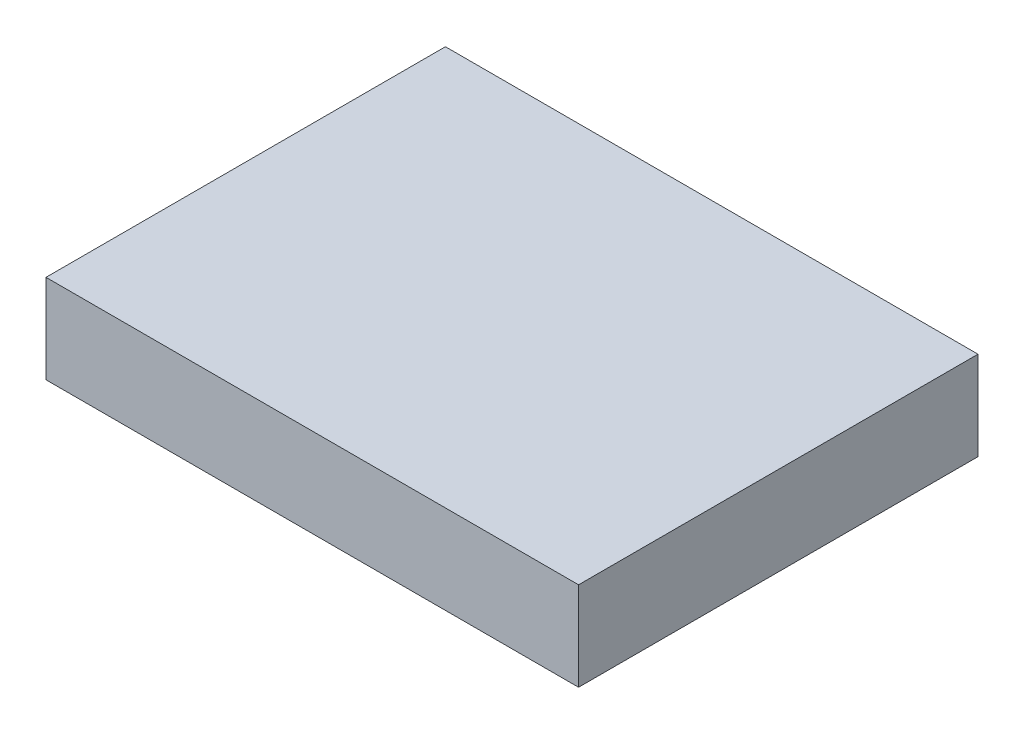
ISO-10303-21;
HEADER;
FILE_DESCRIPTION(('STEP AP214'),'2;1');
FILE_NAME('part.step','',(''),(''),'','','');
FILE_SCHEMA(('AUTOMOTIVE_DESIGN { 1 0 10303 214 1 1 1 1 }'));
ENDSEC;
DATA;
#1=APPLICATION_CONTEXT('core data for automotive mechanical design processes');
#2=APPLICATION_PROTOCOL_DEFINITION('international standard','automotive_design',2000,#1);
#3=PRODUCT_CONTEXT('',#1,'mechanical');
#4=PRODUCT('Part','Part','',(#3));
#5=PRODUCT_RELATED_PRODUCT_CATEGORY('part','',(#4));
#6=PRODUCT_DEFINITION_FORMATION('','',#4);
#7=PRODUCT_DEFINITION_CONTEXT('part definition',#1,'design');
#8=PRODUCT_DEFINITION('design','',#6,#7);
#9=PRODUCT_DEFINITION_SHAPE('','',#8);
#10=(LENGTH_UNIT() NAMED_UNIT(*) SI_UNIT(.MILLI.,.METRE.));
#11=(NAMED_UNIT(*) PLANE_ANGLE_UNIT() SI_UNIT($,.RADIAN.));
#12=(NAMED_UNIT(*) SI_UNIT($,.STERADIAN.) SOLID_ANGLE_UNIT());
#13=UNCERTAINTY_MEASURE_WITH_UNIT(LENGTH_MEASURE(1.E-05),#10,'distance_accuracy_value','');
#14=(GEOMETRIC_REPRESENTATION_CONTEXT(3) GLOBAL_UNCERTAINTY_ASSIGNED_CONTEXT((#13)) GLOBAL_UNIT_ASSIGNED_CONTEXT((#10,
#11,#12)) REPRESENTATION_CONTEXT('',''));
#15=CARTESIAN_POINT('',(0.,0.,0.));
#16=DIRECTION('',(0.,0.,1.));
#17=DIRECTION('',(1.,0.,0.));
#18=AXIS2_PLACEMENT_3D('',#15,#16,#17);
#19=CARTESIAN_POINT('',(-30.,10.,-22.5));
#20=DIRECTION('',(1.,0.,0.));
#21=DIRECTION('',(0.,0.,-1.));
#22=AXIS2_PLACEMENT_3D('',#19,#20,#21);
#23=PLANE('',#22);
#24=DIRECTION('',(0.,0.,1.));
#25=VECTOR('',#24,1.);
#26=CARTESIAN_POINT('',(-30.,0.,-22.5));
#27=LINE('',#26,#25);
#28=CARTESIAN_POINT('',(-30.,0.,-22.5));
#29=VERTEX_POINT('',#28);
#30=CARTESIAN_POINT('',(-30.,0.,22.5));
#31=VERTEX_POINT('',#30);
#32=EDGE_CURVE('E97',#29,#31,#27,.T.);
#33=ORIENTED_EDGE('',*,*,#32,.T.);
#34=DIRECTION('',(0.,-1.,0.));
#35=VECTOR('',#34,1.);
#36=CARTESIAN_POINT('',(-30.,10.,22.5));
#37=LINE('',#36,#35);
#38=CARTESIAN_POINT('',(-30.,10.,22.5));
#39=VERTEX_POINT('',#38);
#40=EDGE_CURVE('E11',#39,#31,#37,.T.);
#41=ORIENTED_EDGE('',*,*,#40,.F.);
#42=DIRECTION('',(0.,0.,1.));
#43=VECTOR('',#42,1.);
#44=CARTESIAN_POINT('',(-30.,10.,-22.5));
#45=LINE('',#44,#43);
#46=CARTESIAN_POINT('',(-30.,10.,-22.5));
#47=VERTEX_POINT('',#46);
#48=EDGE_CURVE('E85',#47,#39,#45,.T.);
#49=ORIENTED_EDGE('',*,*,#48,.F.);
#50=DIRECTION('',(0.,-1.,0.));
#51=VECTOR('',#50,1.);
#52=CARTESIAN_POINT('',(-30.,10.,-22.5));
#53=LINE('',#52,#51);
#54=EDGE_CURVE('E93',#47,#29,#53,.T.);
#55=ORIENTED_EDGE('',*,*,#54,.T.);
#56=EDGE_LOOP('',(#33,#41,#49,#55));
#57=FACE_BOUND('',#56,.T.);
#58=ADVANCED_FACE('F34',(#57),#23,.F.);
#59=CARTESIAN_POINT('',(30.,10.,22.5));
#60=DIRECTION('',(0.,0.,-1.));
#61=DIRECTION('',(-1.,0.,0.));
#62=AXIS2_PLACEMENT_3D('',#59,#60,#61);
#63=PLANE('',#62);
#64=DIRECTION('',(1.,0.,0.));
#65=VECTOR('',#64,1.);
#66=CARTESIAN_POINT('',(30.,0.,22.5));
#67=LINE('',#66,#65);
#68=CARTESIAN_POINT('',(30.,0.,22.5));
#69=VERTEX_POINT('',#68);
#70=EDGE_CURVE('E89',#31,#69,#67,.T.);
#71=ORIENTED_EDGE('',*,*,#70,.T.);
#72=DIRECTION('',(0.,-1.,0.));
#73=VECTOR('',#72,1.);
#74=CARTESIAN_POINT('',(30.,10.,22.5));
#75=LINE('',#74,#73);
#76=CARTESIAN_POINT('',(30.,10.,22.5));
#77=VERTEX_POINT('',#76);
#78=EDGE_CURVE('E42',#77,#69,#75,.T.);
#79=ORIENTED_EDGE('',*,*,#78,.F.);
#80=DIRECTION('',(1.,0.,0.));
#81=VECTOR('',#80,1.);
#82=CARTESIAN_POINT('',(30.,10.,22.5));
#83=LINE('',#82,#81);
#84=EDGE_CURVE('E80',#39,#77,#83,.T.);
#85=ORIENTED_EDGE('',*,*,#84,.F.);
#86=ORIENTED_EDGE('',*,*,#40,.T.);
#87=EDGE_LOOP('',(#71,#79,#85,#86));
#88=FACE_BOUND('',#87,.T.);
#89=ADVANCED_FACE('F88',(#88),#63,.F.);
#90=CARTESIAN_POINT('',(30.,10.,-22.5));
#91=DIRECTION('',(-1.,0.,0.));
#92=DIRECTION('',(0.,0.,1.));
#93=AXIS2_PLACEMENT_3D('',#90,#91,#92);
#94=PLANE('',#93);
#95=DIRECTION('',(0.,0.,-1.));
#96=VECTOR('',#95,1.);
#97=CARTESIAN_POINT('',(30.,0.,-22.5));
#98=LINE('',#97,#96);
#99=CARTESIAN_POINT('',(30.,0.,-22.5));
#100=VERTEX_POINT('',#99);
#101=EDGE_CURVE('E67',#69,#100,#98,.T.);
#102=ORIENTED_EDGE('',*,*,#101,.T.);
#103=DIRECTION('',(0.,-1.,0.));
#104=VECTOR('',#103,1.);
#105=CARTESIAN_POINT('',(30.,10.,-22.5));
#106=LINE('',#105,#104);
#107=CARTESIAN_POINT('',(30.,10.,-22.5));
#108=VERTEX_POINT('',#107);
#109=EDGE_CURVE('E90',#108,#100,#106,.T.);
#110=ORIENTED_EDGE('',*,*,#109,.F.);
#111=DIRECTION('',(0.,0.,-1.));
#112=VECTOR('',#111,1.);
#113=CARTESIAN_POINT('',(30.,10.,-22.5));
#114=LINE('',#113,#112);
#115=EDGE_CURVE('E83',#77,#108,#114,.T.);
#116=ORIENTED_EDGE('',*,*,#115,.F.);
#117=ORIENTED_EDGE('',*,*,#78,.T.);
#118=EDGE_LOOP('',(#102,#110,#116,#117));
#119=FACE_BOUND('',#118,.T.);
#120=ADVANCED_FACE('F91',(#119),#94,.F.);
#121=CARTESIAN_POINT('',(30.,10.,-22.5));
#122=DIRECTION('',(0.,0.,1.));
#123=DIRECTION('',(1.,0.,0.));
#124=AXIS2_PLACEMENT_3D('',#121,#122,#123);
#125=PLANE('',#124);
#126=DIRECTION('',(-1.,0.,0.));
#127=VECTOR('',#126,1.);
#128=CARTESIAN_POINT('',(30.,0.,-22.5));
#129=LINE('',#128,#127);
#130=EDGE_CURVE('E73',#100,#29,#129,.T.);
#131=ORIENTED_EDGE('',*,*,#130,.T.);
#132=ORIENTED_EDGE('',*,*,#54,.F.);
#133=DIRECTION('',(-1.,0.,0.));
#134=VECTOR('',#133,1.);
#135=CARTESIAN_POINT('',(30.,10.,-22.5));
#136=LINE('',#135,#134);
#137=EDGE_CURVE('E50',#108,#47,#136,.T.);
#138=ORIENTED_EDGE('',*,*,#137,.F.);
#139=ORIENTED_EDGE('',*,*,#109,.T.);
#140=EDGE_LOOP('',(#131,#132,#138,#139));
#141=FACE_BOUND('',#140,.T.);
#142=ADVANCED_FACE('F104',(#141),#125,.F.);
#143=CARTESIAN_POINT('',(0.,10.,0.));
#144=DIRECTION('',(0.,-1.,0.));
#145=DIRECTION('',(0.,0.,-1.));
#146=AXIS2_PLACEMENT_3D('',#143,#144,#145);
#147=PLANE('',#146);
#148=ORIENTED_EDGE('',*,*,#48,.T.);
#149=ORIENTED_EDGE('',*,*,#84,.T.);
#150=ORIENTED_EDGE('',*,*,#115,.T.);
#151=ORIENTED_EDGE('',*,*,#137,.T.);
#152=EDGE_LOOP('',(#148,#149,#150,#151));
#153=FACE_BOUND('',#152,.T.);
#154=ADVANCED_FACE('F81',(#153),#147,.F.);
#155=CARTESIAN_POINT('',(0.,0.,0.));
#156=DIRECTION('',(0.,-1.,0.));
#157=DIRECTION('',(0.,0.,-1.));
#158=AXIS2_PLACEMENT_3D('',#155,#156,#157);
#159=PLANE('',#158);
#160=ORIENTED_EDGE('',*,*,#32,.F.);
#161=ORIENTED_EDGE('',*,*,#130,.F.);
#162=ORIENTED_EDGE('',*,*,#101,.F.);
#163=ORIENTED_EDGE('',*,*,#70,.F.);
#164=EDGE_LOOP('',(#160,#161,#162,#163));
#165=FACE_BOUND('',#164,.T.);
#166=ADVANCED_FACE('F107',(#165),#159,.T.);
#167=CLOSED_SHELL('',(#58,#89,#120,#142,#154,#166));
#168=MANIFOLD_SOLID_BREP('B2',#167);
#169=ADVANCED_BREP_SHAPE_REPRESENTATION('',(#18,#168),#14);
#170=SHAPE_DEFINITION_REPRESENTATION(#9,#169);
ENDSEC;
END-ISO-10303-21;
